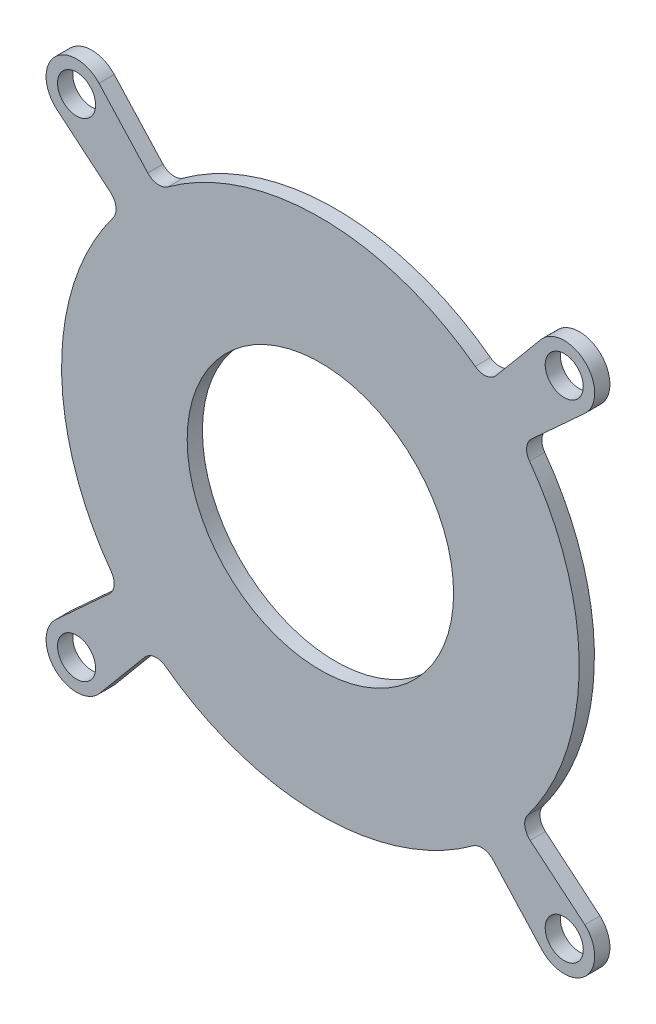
ISO-10303-21;
HEADER;
FILE_DESCRIPTION(('STEP AP214'),'2;1');
FILE_NAME('part.step','',(''),(''),'','','');
FILE_SCHEMA(('AUTOMOTIVE_DESIGN { 1 0 10303 214 1 1 1 1 }'));
ENDSEC;
DATA;
#1=APPLICATION_CONTEXT('core data for automotive mechanical design processes');
#2=APPLICATION_PROTOCOL_DEFINITION('international standard','automotive_design',2000,#1);
#3=PRODUCT_CONTEXT('',#1,'mechanical');
#4=PRODUCT('Part','Part','',(#3));
#5=PRODUCT_RELATED_PRODUCT_CATEGORY('part','',(#4));
#6=PRODUCT_DEFINITION_FORMATION('','',#4);
#7=PRODUCT_DEFINITION_CONTEXT('part definition',#1,'design');
#8=PRODUCT_DEFINITION('design','',#6,#7);
#9=PRODUCT_DEFINITION_SHAPE('','',#8);
#10=(LENGTH_UNIT() NAMED_UNIT(*) SI_UNIT(.MILLI.,.METRE.));
#11=(NAMED_UNIT(*) PLANE_ANGLE_UNIT() SI_UNIT($,.RADIAN.));
#12=(NAMED_UNIT(*) SI_UNIT($,.STERADIAN.) SOLID_ANGLE_UNIT());
#13=UNCERTAINTY_MEASURE_WITH_UNIT(LENGTH_MEASURE(1.E-05),#10,'distance_accuracy_value','');
#14=(GEOMETRIC_REPRESENTATION_CONTEXT(3) GLOBAL_UNCERTAINTY_ASSIGNED_CONTEXT((#13)) GLOBAL_UNIT_ASSIGNED_CONTEXT((#10,
#11,#12)) REPRESENTATION_CONTEXT('',''));
#15=CARTESIAN_POINT('',(0.,0.,0.));
#16=DIRECTION('',(0.,0.,1.));
#17=DIRECTION('',(1.,0.,0.));
#18=AXIS2_PLACEMENT_3D('',#15,#16,#17);
#19=CARTESIAN_POINT('',(32.0354727216565,-31.5983298645137,2.));
#20=DIRECTION('',(0.,0.,1.));
#21=DIRECTION('',(1.,0.,0.));
#22=AXIS2_PLACEMENT_3D('',#19,#20,#21);
#23=PLANE('',#22);
#24=CARTESIAN_POINT('',(32.0354727216543,32.4726155787952,2.));
#25=DIRECTION('',(0.,0.,1.));
#26=DIRECTION('',(1.,0.,0.));
#27=AXIS2_PLACEMENT_3D('',#24,#25,#26);
#28=CIRCLE('',#27,2.5000000000029);
#29=CARTESIAN_POINT('',(34.5354727216572,32.4726155787952,2.));
#30=VERTEX_POINT('',#29);
#31=EDGE_CURVE('E528',#30,#30,#28,.T.);
#32=ORIENTED_EDGE('',*,*,#31,.F.);
#33=EDGE_LOOP('',(#32));
#34=FACE_BOUND('',#33,.T.);
#35=CARTESIAN_POINT('',(-32.0354727216524,-31.5983298645159,2.));
#36=DIRECTION('',(0.,0.,1.));
#37=DIRECTION('',(1.,0.,0.));
#38=AXIS2_PLACEMENT_3D('',#35,#36,#37);
#39=CIRCLE('',#38,2.49999999999642);
#40=CARTESIAN_POINT('',(-29.535472721656,-31.5983298645159,2.));
#41=VERTEX_POINT('',#40);
#42=EDGE_CURVE('E544',#41,#41,#39,.T.);
#43=ORIENTED_EDGE('',*,*,#42,.F.);
#44=EDGE_LOOP('',(#43));
#45=FACE_BOUND('',#44,.T.);
#46=CARTESIAN_POINT('',(32.0354727216565,-31.5983298645137,2.));
#47=DIRECTION('',(0.,0.,1.));
#48=DIRECTION('',(1.,0.,0.));
#49=AXIS2_PLACEMENT_3D('',#46,#47,#48);
#50=CIRCLE('',#49,4.00000000000003);
#51=CARTESIAN_POINT('',(29.0849413750936,-34.2991380348491,2.));
#52=VERTEX_POINT('',#51);
#53=CARTESIAN_POINT('',(34.7362808919919,-28.6477985179509,2.));
#54=VERTEX_POINT('',#53);
#55=EDGE_CURVE('E308',#52,#54,#50,.T.);
#56=ORIENTED_EDGE('',*,*,#55,.T.);
#57=DIRECTION('',(-0.766720690696216,0.641980827173458,0.));
#58=VECTOR('',#57,1.);
#59=CARTESIAN_POINT('',(34.7362808919919,-28.6477985179509,2.));
#60=LINE('',#59,#58);
#61=CARTESIAN_POINT('',(27.5593163533478,-22.6384737572881,2.));
#62=VERTEX_POINT('',#61);
#63=EDGE_CURVE('E148',#54,#62,#60,.T.);
#64=ORIENTED_EDGE('',*,*,#63,.T.);
#65=CARTESIAN_POINT('',(28.8432780076946,-21.1050323758959,2.));
#66=DIRECTION('',(0.,0.,-1.));
#67=DIRECTION('',(-1.,0.,0.));
#68=AXIS2_PLACEMENT_3D('',#65,#66,#67);
#69=CIRCLE('',#68,1.99999999999967);
#70=CARTESIAN_POINT('',(27.2408736739341,-19.9082448629495,2.));
#71=VERTEX_POINT('',#70);
#72=EDGE_CURVE('E393',#62,#71,#69,.T.);
#73=ORIENTED_EDGE('',*,*,#72,.T.);
#74=CARTESIAN_POINT('',(9.99200722162641E-13,0.437142857142837,2.));
#75=DIRECTION('',(0.,0.,1.));
#76=DIRECTION('',(1.,0.,0.));
#77=AXIS2_PLACEMENT_3D('',#74,#75,#76);
#78=CIRCLE('',#77,34.000000000001);
#79=CARTESIAN_POINT('',(27.4749871011398,20.4652502013809,2.));
#80=VERTEX_POINT('',#79);
#81=EDGE_CURVE('E413',#71,#80,#78,.T.);
#82=ORIENTED_EDGE('',*,*,#81,.T.);
#83=CARTESIAN_POINT('',(29.0911628129714,21.6433741628067,2.));
#84=DIRECTION('',(0.,0.,-1.));
#85=DIRECTION('',(1.,0.,0.));
#86=AXIS2_PLACEMENT_3D('',#83,#84,#85);
#87=CIRCLE('',#86,1.99999999999999);
#88=CARTESIAN_POINT('',(27.7407587278038,23.1186398360881,2.));
#89=VERTEX_POINT('',#88);
#90=EDGE_CURVE('E409',#80,#89,#87,.T.);
#91=ORIENTED_EDGE('',*,*,#90,.T.);
#92=DIRECTION('',(0.7376328366407,0.675202042583843,0.));
#93=VECTOR('',#92,1.);
#94=CARTESIAN_POINT('',(34.7362808919891,29.5220842322318,2.));
#95=LINE('',#94,#93);
#96=CARTESIAN_POINT('',(34.7362808919891,29.5220842322318,2.));
#97=VERTEX_POINT('',#96);
#98=EDGE_CURVE('E412',#89,#97,#95,.T.);
#99=ORIENTED_EDGE('',*,*,#98,.T.);
#100=CARTESIAN_POINT('',(32.0354727216462,32.4726155787877,2.));
#101=DIRECTION('',(0.,0.,1.));
#102=DIRECTION('',(1.,0.,0.));
#103=AXIS2_PLACEMENT_3D('',#100,#101,#102);
#104=CIRCLE('',#103,4.00000000000003);
#105=CARTESIAN_POINT('',(29.0849413750908,35.1734237491312,2.));
#106=VERTEX_POINT('',#105);
#107=EDGE_CURVE('E417',#97,#106,#104,.T.);
#108=ORIENTED_EDGE('',*,*,#107,.T.);
#109=DIRECTION('',(-0.641980827173504,-0.766720690696178,0.));
#110=VECTOR('',#109,1.);
#111=CARTESIAN_POINT('',(29.0849413750908,35.1734237491312,2.));
#112=LINE('',#111,#110);
#113=CARTESIAN_POINT('',(23.0756166144313,27.9964592104921,2.));
#114=VERTEX_POINT('',#113);
#115=EDGE_CURVE('E424',#106,#114,#112,.T.);
#116=ORIENTED_EDGE('',*,*,#115,.T.);
#117=CARTESIAN_POINT('',(21.5421752330389,29.280420864839,2.));
#118=DIRECTION('',(0.,0.,-1.));
#119=DIRECTION('',(-1.,0.,0.));
#120=AXIS2_PLACEMENT_3D('',#117,#118,#119);
#121=CIRCLE('',#120,2.);
#122=CARTESIAN_POINT('',(20.3453877200923,27.6780165310783,2.));
#123=VERTEX_POINT('',#122);
#124=EDGE_CURVE('E427',#114,#123,#121,.T.);
#125=ORIENTED_EDGE('',*,*,#124,.T.);
#126=CARTESIAN_POINT('',(3.23767156700697E-13,0.437142857144609,2.));
#127=DIRECTION('',(0.,0.,1.));
#128=DIRECTION('',(1.,0.,0.));
#129=AXIS2_PLACEMENT_3D('',#126,#127,#128);
#130=CIRCLE('',#129,34.0000000000012);
#131=CARTESIAN_POINT('',(-20.0281073442409,27.9121299582814,2.));
#132=VERTEX_POINT('',#131);
#133=EDGE_CURVE('E430',#123,#132,#130,.T.);
#134=ORIENTED_EDGE('',*,*,#133,.T.);
#135=CARTESIAN_POINT('',(-21.2062313056668,29.5283056701129,2.));
#136=DIRECTION('',(0.,0.,-1.));
#137=DIRECTION('',(1.,0.,0.));
#138=AXIS2_PLACEMENT_3D('',#135,#136,#137);
#139=CIRCLE('',#138,1.99999999999998);
#140=CARTESIAN_POINT('',(-22.6814969789482,28.1779015849453,2.));
#141=VERTEX_POINT('',#140);
#142=EDGE_CURVE('E433',#132,#141,#139,.T.);
#143=ORIENTED_EDGE('',*,*,#142,.T.);
#144=DIRECTION('',(-0.675202042583903,0.737632836640645,0.));
#145=VECTOR('',#144,1.);
#146=CARTESIAN_POINT('',(-29.0849413750926,35.1734237491302,2.));
#147=LINE('',#146,#145);
#148=CARTESIAN_POINT('',(-29.0849413750925,35.1734237491302,2.));
#149=VERTEX_POINT('',#148);
#150=EDGE_CURVE('E436',#141,#149,#147,.T.);
#151=ORIENTED_EDGE('',*,*,#150,.T.);
#152=CARTESIAN_POINT('',(-32.0354727216854,32.4726155788242,2.));
#153=DIRECTION('',(0.,0.,1.));
#154=DIRECTION('',(1.,0.,0.));
#155=AXIS2_PLACEMENT_3D('',#152,#153,#154);
#156=CIRCLE('',#155,4.00000000000233);
#157=CARTESIAN_POINT('',(-34.7362808919923,29.5220842322322,2.));
#158=VERTEX_POINT('',#157);
#159=EDGE_CURVE('E439',#149,#158,#156,.T.);
#160=ORIENTED_EDGE('',*,*,#159,.T.);
#161=DIRECTION('',(0.76672069069621,-0.641980827173466,0.));
#162=VECTOR('',#161,1.);
#163=CARTESIAN_POINT('',(-34.7362808919923,29.5220842322322,2.));
#164=LINE('',#163,#162);
#165=CARTESIAN_POINT('',(-27.5593163533485,23.5127594715695,2.));
#166=VERTEX_POINT('',#165);
#167=EDGE_CURVE('E442',#158,#166,#164,.T.);
#168=ORIENTED_EDGE('',*,*,#167,.T.);
#169=CARTESIAN_POINT('',(-28.8432780076955,21.9793180901771,2.));
#170=DIRECTION('',(0.,0.,-1.));
#171=DIRECTION('',(-1.,0.,0.));
#172=AXIS2_PLACEMENT_3D('',#169,#170,#171);
#173=CIRCLE('',#172,2.00000000000002);
#174=CARTESIAN_POINT('',(-27.2408736739342,20.7825305772304,2.));
#175=VERTEX_POINT('',#174);
#176=EDGE_CURVE('E445',#166,#175,#173,.T.);
#177=ORIENTED_EDGE('',*,*,#176,.T.);
#178=CARTESIAN_POINT('',(7.35522753814166E-13,0.437142857142837,2.));
#179=DIRECTION('',(0.,0.,1.));
#180=DIRECTION('',(1.,0.,0.));
#181=AXIS2_PLACEMENT_3D('',#178,#179,#180);
#182=CIRCLE('',#181,33.9999999999996);
#183=CARTESIAN_POINT('',(-27.474987101134,-19.5909644870978,2.));
#184=VERTEX_POINT('',#183);
#185=EDGE_CURVE('E448',#175,#184,#182,.T.);
#186=ORIENTED_EDGE('',*,*,#185,.T.);
#187=CARTESIAN_POINT('',(-29.0911628129655,-20.7690884485238,2.));
#188=DIRECTION('',(0.,0.,-1.));
#189=DIRECTION('',(1.,0.,0.));
#190=AXIS2_PLACEMENT_3D('',#187,#188,#189);
#191=CIRCLE('',#190,2.);
#192=CARTESIAN_POINT('',(-27.7407587277978,-22.2443541218052,2.));
#193=VERTEX_POINT('',#192);
#194=EDGE_CURVE('E451',#184,#193,#191,.T.);
#195=ORIENTED_EDGE('',*,*,#194,.T.);
#196=DIRECTION('',(-0.737632836640711,-0.675202042583831,0.));
#197=VECTOR('',#196,1.);
#198=CARTESIAN_POINT('',(-34.7362808919889,-28.647798517954,2.));
#199=LINE('',#198,#197);
#200=CARTESIAN_POINT('',(-34.7362808919889,-28.6477985179541,2.));
#201=VERTEX_POINT('',#200);
#202=EDGE_CURVE('E454',#193,#201,#199,.T.);
#203=ORIENTED_EDGE('',*,*,#202,.T.);
#204=CARTESIAN_POINT('',(-32.0354727216524,-31.5983298645159,2.));
#205=DIRECTION('',(0.,0.,1.));
#206=DIRECTION('',(1.,0.,0.));
#207=AXIS2_PLACEMENT_3D('',#204,#205,#206);
#208=CIRCLE('',#207,4.00000000000007);
#209=CARTESIAN_POINT('',(-29.0849413750896,-34.2991380348513,2.));
#210=VERTEX_POINT('',#209);
#211=EDGE_CURVE('E457',#201,#210,#208,.T.);
#212=ORIENTED_EDGE('',*,*,#211,.T.);
#213=DIRECTION('',(0.641980827173464,0.766720690696211,0.));
#214=VECTOR('',#213,1.);
#215=CARTESIAN_POINT('',(-29.0849413750896,-34.2991380348513,2.));
#216=LINE('',#215,#214);
#217=CARTESIAN_POINT('',(-23.0756166144263,-27.1221734962068,2.));
#218=VERTEX_POINT('',#217);
#219=EDGE_CURVE('E460',#210,#218,#216,.T.);
#220=ORIENTED_EDGE('',*,*,#219,.T.);
#221=CARTESIAN_POINT('',(-21.5421752330338,-28.4061351505537,2.));
#222=DIRECTION('',(0.,0.,-1.));
#223=DIRECTION('',(-1.,0.,0.));
#224=AXIS2_PLACEMENT_3D('',#221,#222,#223);
#225=CIRCLE('',#224,2.00000000000001);
#226=CARTESIAN_POINT('',(-20.3453877200875,-26.8037308167928,2.));
#227=VERTEX_POINT('',#226);
#228=EDGE_CURVE('E215',#218,#227,#225,.T.);
#229=ORIENTED_EDGE('',*,*,#228,.T.);
#230=CARTESIAN_POINT('',(0.,0.437142857143018,2.));
#231=DIRECTION('',(0.,0.,1.));
#232=DIRECTION('',(1.,0.,0.));
#233=AXIS2_PLACEMENT_3D('',#230,#231,#232);
#234=CIRCLE('',#233,34.0000000000002);
#235=CARTESIAN_POINT('',(20.0281073442381,-27.0378442439947,2.));
#236=VERTEX_POINT('',#235);
#237=EDGE_CURVE('E209',#227,#236,#234,.T.);
#238=ORIENTED_EDGE('',*,*,#237,.T.);
#239=CARTESIAN_POINT('',(21.2062313056639,-28.6540199558263,2.));
#240=DIRECTION('',(0.,0.,-1.));
#241=DIRECTION('',(1.,0.,0.));
#242=AXIS2_PLACEMENT_3D('',#239,#240,#241);
#243=CIRCLE('',#242,2.);
#244=CARTESIAN_POINT('',(22.6814969789453,-27.3036158706586,2.));
#245=VERTEX_POINT('',#244);
#246=EDGE_CURVE('E213',#236,#245,#243,.T.);
#247=ORIENTED_EDGE('',*,*,#246,.T.);
#248=DIRECTION('',(0.675202042583839,-0.737632836640704,0.));
#249=VECTOR('',#248,1.);
#250=CARTESIAN_POINT('',(29.0849413750936,-34.2991380348491,2.));
#251=LINE('',#250,#249);
#252=EDGE_CURVE('E57',#245,#52,#251,.T.);
#253=ORIENTED_EDGE('',*,*,#252,.T.);
#254=EDGE_LOOP('',(#56,#64,#73,#82,#91,#99,#108,#116,#125,#134,#143,#151,#160,#168,#177,#186,
#195,#203,#212,#220,#229,#238,#247,#253));
#255=FACE_BOUND('',#254,.T.);
#256=CARTESIAN_POINT('',(32.0354727216565,-31.5983298645137,2.));
#257=DIRECTION('',(0.,0.,1.));
#258=DIRECTION('',(1.,0.,0.));
#259=AXIS2_PLACEMENT_3D('',#256,#257,#258);
#260=CIRCLE('',#259,2.5);
#261=CARTESIAN_POINT('',(34.5354727216565,-31.5983298645137,2.));
#262=VERTEX_POINT('',#261);
#263=EDGE_CURVE('E242',#262,#262,#260,.T.);
#264=ORIENTED_EDGE('',*,*,#263,.F.);
#265=EDGE_LOOP('',(#264));
#266=FACE_BOUND('',#265,.T.);
#267=CARTESIAN_POINT('',(-32.0354727216546,32.4726155787929,2.));
#268=DIRECTION('',(0.,0.,1.));
#269=DIRECTION('',(1.,0.,0.));
#270=AXIS2_PLACEMENT_3D('',#267,#268,#269);
#271=CIRCLE('',#270,2.4999999999996);
#272=CARTESIAN_POINT('',(-29.535472721655,32.4726155787929,2.));
#273=VERTEX_POINT('',#272);
#274=EDGE_CURVE('E536',#273,#273,#271,.T.);
#275=ORIENTED_EDGE('',*,*,#274,.F.);
#276=EDGE_LOOP('',(#275));
#277=FACE_BOUND('',#276,.T.);
#278=CARTESIAN_POINT('',(3.23767156700697E-13,0.437142857144609,2.));
#279=DIRECTION('',(0.,0.,1.));
#280=DIRECTION('',(1.,0.,0.));
#281=AXIS2_PLACEMENT_3D('',#278,#279,#280);
#282=CIRCLE('',#281,17.5);
#283=CARTESIAN_POINT('',(17.5000000000003,0.437142857144609,2.));
#284=VERTEX_POINT('',#283);
#285=EDGE_CURVE('E517',#284,#284,#282,.T.);
#286=ORIENTED_EDGE('',*,*,#285,.F.);
#287=EDGE_LOOP('',(#286));
#288=FACE_BOUND('',#287,.T.);
#289=ADVANCED_FACE('F39',(#34,#45,#255,#266,#277,#288),#23,.T.);
#290=CARTESIAN_POINT('',(32.0354727216565,-31.5983298645137,0.));
#291=DIRECTION('',(0.,0.,1.));
#292=DIRECTION('',(1.,0.,0.));
#293=AXIS2_PLACEMENT_3D('',#290,#291,#292);
#294=PLANE('',#293);
#295=CARTESIAN_POINT('',(32.0354727216565,-31.5983298645137,0.));
#296=DIRECTION('',(0.,0.,1.));
#297=DIRECTION('',(1.,0.,0.));
#298=AXIS2_PLACEMENT_3D('',#295,#296,#297);
#299=CIRCLE('',#298,4.00000000000003);
#300=CARTESIAN_POINT('',(29.0849413750936,-34.2991380348491,0.));
#301=VERTEX_POINT('',#300);
#302=CARTESIAN_POINT('',(34.7362808919919,-28.6477985179509,0.));
#303=VERTEX_POINT('',#302);
#304=EDGE_CURVE('E237',#301,#303,#299,.T.);
#305=ORIENTED_EDGE('',*,*,#304,.F.);
#306=DIRECTION('',(0.675202042583839,-0.737632836640704,0.));
#307=VECTOR('',#306,1.);
#308=CARTESIAN_POINT('',(29.0849413750936,-34.2991380348491,0.));
#309=LINE('',#308,#307);
#310=CARTESIAN_POINT('',(22.6814969789453,-27.3036158706586,0.));
#311=VERTEX_POINT('',#310);
#312=EDGE_CURVE('E140',#311,#301,#309,.T.);
#313=ORIENTED_EDGE('',*,*,#312,.F.);
#314=CARTESIAN_POINT('',(21.2062313056639,-28.6540199558263,0.));
#315=DIRECTION('',(0.,0.,-1.));
#316=DIRECTION('',(1.,0.,0.));
#317=AXIS2_PLACEMENT_3D('',#314,#315,#316);
#318=CIRCLE('',#317,2.);
#319=CARTESIAN_POINT('',(20.0281073442381,-27.0378442439947,0.));
#320=VERTEX_POINT('',#319);
#321=EDGE_CURVE('E134',#320,#311,#318,.T.);
#322=ORIENTED_EDGE('',*,*,#321,.F.);
#323=CARTESIAN_POINT('',(0.,0.437142857143018,0.));
#324=DIRECTION('',(0.,0.,1.));
#325=DIRECTION('',(1.,0.,0.));
#326=AXIS2_PLACEMENT_3D('',#323,#324,#325);
#327=CIRCLE('',#326,34.0000000000002);
#328=CARTESIAN_POINT('',(-20.3453877200875,-26.8037308167928,0.));
#329=VERTEX_POINT('',#328);
#330=EDGE_CURVE('E224',#329,#320,#327,.T.);
#331=ORIENTED_EDGE('',*,*,#330,.F.);
#332=CARTESIAN_POINT('',(-21.5421752330338,-28.4061351505537,0.));
#333=DIRECTION('',(0.,0.,-1.));
#334=DIRECTION('',(-1.,0.,0.));
#335=AXIS2_PLACEMENT_3D('',#332,#333,#334);
#336=CIRCLE('',#335,2.00000000000001);
#337=CARTESIAN_POINT('',(-23.0756166144263,-27.1221734962068,0.));
#338=VERTEX_POINT('',#337);
#339=EDGE_CURVE('E299',#338,#329,#336,.T.);
#340=ORIENTED_EDGE('',*,*,#339,.F.);
#341=DIRECTION('',(0.641980827173464,0.766720690696211,0.));
#342=VECTOR('',#341,1.);
#343=CARTESIAN_POINT('',(-29.0849413750896,-34.2991380348513,0.));
#344=LINE('',#343,#342);
#345=CARTESIAN_POINT('',(-29.0849413750896,-34.2991380348513,0.));
#346=VERTEX_POINT('',#345);
#347=EDGE_CURVE('E296',#346,#338,#344,.T.);
#348=ORIENTED_EDGE('',*,*,#347,.F.);
#349=CARTESIAN_POINT('',(-32.0354727216524,-31.5983298645159,0.));
#350=DIRECTION('',(0.,0.,1.));
#351=DIRECTION('',(1.,0.,0.));
#352=AXIS2_PLACEMENT_3D('',#349,#350,#351);
#353=CIRCLE('',#352,4.00000000000007);
#354=CARTESIAN_POINT('',(-34.7362808919889,-28.6477985179541,0.));
#355=VERTEX_POINT('',#354);
#356=EDGE_CURVE('E293',#355,#346,#353,.T.);
#357=ORIENTED_EDGE('',*,*,#356,.F.);
#358=DIRECTION('',(-0.737632836640711,-0.675202042583831,0.));
#359=VECTOR('',#358,1.);
#360=CARTESIAN_POINT('',(-34.7362808919889,-28.647798517954,0.));
#361=LINE('',#360,#359);
#362=CARTESIAN_POINT('',(-27.7407587277978,-22.2443541218052,0.));
#363=VERTEX_POINT('',#362);
#364=EDGE_CURVE('E290',#363,#355,#361,.T.);
#365=ORIENTED_EDGE('',*,*,#364,.F.);
#366=CARTESIAN_POINT('',(-29.0911628129655,-20.7690884485238,0.));
#367=DIRECTION('',(0.,0.,-1.));
#368=DIRECTION('',(1.,0.,0.));
#369=AXIS2_PLACEMENT_3D('',#366,#367,#368);
#370=CIRCLE('',#369,2.);
#371=CARTESIAN_POINT('',(-27.474987101134,-19.5909644870978,0.));
#372=VERTEX_POINT('',#371);
#373=EDGE_CURVE('E287',#372,#363,#370,.T.);
#374=ORIENTED_EDGE('',*,*,#373,.F.);
#375=CARTESIAN_POINT('',(7.35522753814166E-13,0.437142857142837,0.));
#376=DIRECTION('',(0.,0.,1.));
#377=DIRECTION('',(1.,0.,0.));
#378=AXIS2_PLACEMENT_3D('',#375,#376,#377);
#379=CIRCLE('',#378,33.9999999999996);
#380=CARTESIAN_POINT('',(-27.2408736739342,20.7825305772304,0.));
#381=VERTEX_POINT('',#380);
#382=EDGE_CURVE('E284',#381,#372,#379,.T.);
#383=ORIENTED_EDGE('',*,*,#382,.F.);
#384=CARTESIAN_POINT('',(-28.8432780076955,21.9793180901771,0.));
#385=DIRECTION('',(0.,0.,-1.));
#386=DIRECTION('',(-1.,0.,0.));
#387=AXIS2_PLACEMENT_3D('',#384,#385,#386);
#388=CIRCLE('',#387,2.00000000000002);
#389=CARTESIAN_POINT('',(-27.5593163533485,23.5127594715695,0.));
#390=VERTEX_POINT('',#389);
#391=EDGE_CURVE('E281',#390,#381,#388,.T.);
#392=ORIENTED_EDGE('',*,*,#391,.F.);
#393=DIRECTION('',(0.76672069069621,-0.641980827173466,0.));
#394=VECTOR('',#393,1.);
#395=CARTESIAN_POINT('',(-34.7362808919923,29.5220842322322,0.));
#396=LINE('',#395,#394);
#397=CARTESIAN_POINT('',(-34.7362808919923,29.5220842322322,0.));
#398=VERTEX_POINT('',#397);
#399=EDGE_CURVE('E278',#398,#390,#396,.T.);
#400=ORIENTED_EDGE('',*,*,#399,.F.);
#401=CARTESIAN_POINT('',(-32.0354727216854,32.4726155788242,0.));
#402=DIRECTION('',(0.,0.,1.));
#403=DIRECTION('',(1.,0.,0.));
#404=AXIS2_PLACEMENT_3D('',#401,#402,#403);
#405=CIRCLE('',#404,4.00000000000233);
#406=CARTESIAN_POINT('',(-29.0849413750925,35.1734237491302,0.));
#407=VERTEX_POINT('',#406);
#408=EDGE_CURVE('E275',#407,#398,#405,.T.);
#409=ORIENTED_EDGE('',*,*,#408,.F.);
#410=DIRECTION('',(-0.675202042583903,0.737632836640645,0.));
#411=VECTOR('',#410,1.);
#412=CARTESIAN_POINT('',(-29.0849413750926,35.1734237491302,0.));
#413=LINE('',#412,#411);
#414=CARTESIAN_POINT('',(-22.6814969789482,28.1779015849453,0.));
#415=VERTEX_POINT('',#414);
#416=EDGE_CURVE('E272',#415,#407,#413,.T.);
#417=ORIENTED_EDGE('',*,*,#416,.F.);
#418=CARTESIAN_POINT('',(-21.2062313056668,29.5283056701129,0.));
#419=DIRECTION('',(0.,0.,-1.));
#420=DIRECTION('',(1.,0.,0.));
#421=AXIS2_PLACEMENT_3D('',#418,#419,#420);
#422=CIRCLE('',#421,1.99999999999998);
#423=CARTESIAN_POINT('',(-20.0281073442409,27.9121299582814,0.));
#424=VERTEX_POINT('',#423);
#425=EDGE_CURVE('E269',#424,#415,#422,.T.);
#426=ORIENTED_EDGE('',*,*,#425,.F.);
#427=CARTESIAN_POINT('',(3.23767156700697E-13,0.437142857144609,0.));
#428=DIRECTION('',(0.,0.,1.));
#429=DIRECTION('',(1.,0.,0.));
#430=AXIS2_PLACEMENT_3D('',#427,#428,#429);
#431=CIRCLE('',#430,34.0000000000012);
#432=CARTESIAN_POINT('',(20.3453877200923,27.6780165310783,0.));
#433=VERTEX_POINT('',#432);
#434=EDGE_CURVE('E266',#433,#424,#431,.T.);
#435=ORIENTED_EDGE('',*,*,#434,.F.);
#436=CARTESIAN_POINT('',(21.5421752330389,29.280420864839,0.));
#437=DIRECTION('',(0.,0.,-1.));
#438=DIRECTION('',(-1.,0.,0.));
#439=AXIS2_PLACEMENT_3D('',#436,#437,#438);
#440=CIRCLE('',#439,2.);
#441=CARTESIAN_POINT('',(23.0756166144313,27.9964592104921,0.));
#442=VERTEX_POINT('',#441);
#443=EDGE_CURVE('E263',#442,#433,#440,.T.);
#444=ORIENTED_EDGE('',*,*,#443,.F.);
#445=DIRECTION('',(-0.641980827173504,-0.766720690696178,0.));
#446=VECTOR('',#445,1.);
#447=CARTESIAN_POINT('',(29.0849413750908,35.1734237491312,0.));
#448=LINE('',#447,#446);
#449=CARTESIAN_POINT('',(29.0849413750908,35.1734237491312,0.));
#450=VERTEX_POINT('',#449);
#451=EDGE_CURVE('E260',#450,#442,#448,.T.);
#452=ORIENTED_EDGE('',*,*,#451,.F.);
#453=CARTESIAN_POINT('',(32.0354727216462,32.4726155787877,0.));
#454=DIRECTION('',(0.,0.,1.));
#455=DIRECTION('',(1.,0.,0.));
#456=AXIS2_PLACEMENT_3D('',#453,#454,#455);
#457=CIRCLE('',#456,4.00000000000003);
#458=CARTESIAN_POINT('',(34.7362808919891,29.5220842322318,0.));
#459=VERTEX_POINT('',#458);
#460=EDGE_CURVE('E257',#459,#450,#457,.T.);
#461=ORIENTED_EDGE('',*,*,#460,.F.);
#462=DIRECTION('',(0.7376328366407,0.675202042583843,0.));
#463=VECTOR('',#462,1.);
#464=CARTESIAN_POINT('',(34.7362808919891,29.5220842322318,0.));
#465=LINE('',#464,#463);
#466=CARTESIAN_POINT('',(27.7407587278038,23.1186398360881,0.));
#467=VERTEX_POINT('',#466);
#468=EDGE_CURVE('E254',#467,#459,#465,.T.);
#469=ORIENTED_EDGE('',*,*,#468,.F.);
#470=CARTESIAN_POINT('',(29.0911628129714,21.6433741628067,0.));
#471=DIRECTION('',(0.,0.,-1.));
#472=DIRECTION('',(1.,0.,0.));
#473=AXIS2_PLACEMENT_3D('',#470,#471,#472);
#474=CIRCLE('',#473,1.99999999999999);
#475=CARTESIAN_POINT('',(27.4749871011398,20.4652502013809,0.));
#476=VERTEX_POINT('',#475);
#477=EDGE_CURVE('E251',#476,#467,#474,.T.);
#478=ORIENTED_EDGE('',*,*,#477,.F.);
#479=CARTESIAN_POINT('',(9.99200722162641E-13,0.437142857142837,0.));
#480=DIRECTION('',(0.,0.,1.));
#481=DIRECTION('',(1.,0.,0.));
#482=AXIS2_PLACEMENT_3D('',#479,#480,#481);
#483=CIRCLE('',#482,34.000000000001);
#484=CARTESIAN_POINT('',(27.2408736739341,-19.9082448629495,0.));
#485=VERTEX_POINT('',#484);
#486=EDGE_CURVE('E248',#485,#476,#483,.T.);
#487=ORIENTED_EDGE('',*,*,#486,.F.);
#488=CARTESIAN_POINT('',(28.8432780076946,-21.1050323758959,0.));
#489=DIRECTION('',(0.,0.,-1.));
#490=DIRECTION('',(-1.,0.,0.));
#491=AXIS2_PLACEMENT_3D('',#488,#489,#490);
#492=CIRCLE('',#491,1.99999999999967);
#493=CARTESIAN_POINT('',(27.5593163533478,-22.6384737572881,0.));
#494=VERTEX_POINT('',#493);
#495=EDGE_CURVE('E245',#494,#485,#492,.T.);
#496=ORIENTED_EDGE('',*,*,#495,.F.);
#497=DIRECTION('',(-0.766720690696216,0.641980827173458,0.));
#498=VECTOR('',#497,1.);
#499=CARTESIAN_POINT('',(34.7362808919919,-28.6477985179509,0.));
#500=LINE('',#499,#498);
#501=EDGE_CURVE('E241',#303,#494,#500,.T.);
#502=ORIENTED_EDGE('',*,*,#501,.F.);
#503=EDGE_LOOP('',(#305,#313,#322,#331,#340,#348,#357,#365,#374,#383,#392,#400,#409,#417,#426,
#435,#444,#452,#461,#469,#478,#487,#496,#502));
#504=FACE_BOUND('',#503,.T.);
#505=CARTESIAN_POINT('',(32.0354727216565,-31.5983298645137,0.));
#506=DIRECTION('',(0.,0.,1.));
#507=DIRECTION('',(1.,0.,0.));
#508=AXIS2_PLACEMENT_3D('',#505,#506,#507);
#509=CIRCLE('',#508,2.5);
#510=CARTESIAN_POINT('',(34.5354727216565,-31.5983298645137,0.));
#511=VERTEX_POINT('',#510);
#512=EDGE_CURVE('E548',#511,#511,#509,.T.);
#513=ORIENTED_EDGE('',*,*,#512,.T.);
#514=EDGE_LOOP('',(#513));
#515=FACE_BOUND('',#514,.T.);
#516=CARTESIAN_POINT('',(-32.0354727216524,-31.5983298645159,0.));
#517=DIRECTION('',(0.,0.,1.));
#518=DIRECTION('',(1.,0.,0.));
#519=AXIS2_PLACEMENT_3D('',#516,#517,#518);
#520=CIRCLE('',#519,2.49999999999642);
#521=CARTESIAN_POINT('',(-29.535472721656,-31.5983298645159,0.));
#522=VERTEX_POINT('',#521);
#523=EDGE_CURVE('E540',#522,#522,#520,.T.);
#524=ORIENTED_EDGE('',*,*,#523,.T.);
#525=EDGE_LOOP('',(#524));
#526=FACE_BOUND('',#525,.T.);
#527=CARTESIAN_POINT('',(-32.0354727216546,32.4726155787929,0.));
#528=DIRECTION('',(0.,0.,1.));
#529=DIRECTION('',(1.,0.,0.));
#530=AXIS2_PLACEMENT_3D('',#527,#528,#529);
#531=CIRCLE('',#530,2.4999999999996);
#532=CARTESIAN_POINT('',(-29.535472721655,32.4726155787929,0.));
#533=VERTEX_POINT('',#532);
#534=EDGE_CURVE('E532',#533,#533,#531,.T.);
#535=ORIENTED_EDGE('',*,*,#534,.T.);
#536=EDGE_LOOP('',(#535));
#537=FACE_BOUND('',#536,.T.);
#538=CARTESIAN_POINT('',(32.0354727216543,32.4726155787952,0.));
#539=DIRECTION('',(0.,0.,1.));
#540=DIRECTION('',(1.,0.,0.));
#541=AXIS2_PLACEMENT_3D('',#538,#539,#540);
#542=CIRCLE('',#541,2.5000000000029);
#543=CARTESIAN_POINT('',(34.5354727216572,32.4726155787952,0.));
#544=VERTEX_POINT('',#543);
#545=EDGE_CURVE('E525',#544,#544,#542,.T.);
#546=ORIENTED_EDGE('',*,*,#545,.T.);
#547=EDGE_LOOP('',(#546));
#548=FACE_BOUND('',#547,.T.);
#549=CARTESIAN_POINT('',(3.23767156700697E-13,0.437142857144609,0.));
#550=DIRECTION('',(0.,0.,1.));
#551=DIRECTION('',(1.,0.,0.));
#552=AXIS2_PLACEMENT_3D('',#549,#550,#551);
#553=CIRCLE('',#552,17.5);
#554=CARTESIAN_POINT('',(17.5000000000003,0.437142857144609,0.));
#555=VERTEX_POINT('',#554);
#556=EDGE_CURVE('E520',#555,#555,#553,.T.);
#557=ORIENTED_EDGE('',*,*,#556,.T.);
#558=EDGE_LOOP('',(#557));
#559=FACE_BOUND('',#558,.T.);
#560=ADVANCED_FACE('F397',(#504,#515,#526,#537,#548,#559),#294,.F.);
#561=CARTESIAN_POINT('',(32.0354727216565,-31.5983298645137,2.));
#562=DIRECTION('',(0.,0.,-1.));
#563=DIRECTION('',(-1.,0.,0.));
#564=AXIS2_PLACEMENT_3D('',#561,#562,#563);
#565=CYLINDRICAL_SURFACE('',#564,4.00000000000003);
#566=ORIENTED_EDGE('',*,*,#304,.T.);
#567=DIRECTION('',(0.,0.,-1.));
#568=VECTOR('',#567,1.);
#569=CARTESIAN_POINT('',(34.7362808919919,-28.6477985179509,2.));
#570=LINE('',#569,#568);
#571=EDGE_CURVE('E11',#54,#303,#570,.T.);
#572=ORIENTED_EDGE('',*,*,#571,.F.);
#573=ORIENTED_EDGE('',*,*,#55,.F.);
#574=DIRECTION('',(0.,0.,-1.));
#575=VECTOR('',#574,1.);
#576=CARTESIAN_POINT('',(29.0849413750936,-34.2991380348491,2.));
#577=LINE('',#576,#575);
#578=EDGE_CURVE('E233',#52,#301,#577,.T.);
#579=ORIENTED_EDGE('',*,*,#578,.T.);
#580=EDGE_LOOP('',(#566,#572,#573,#579));
#581=FACE_BOUND('',#580,.T.);
#582=ADVANCED_FACE('F41',(#581),#565,.T.);
#583=CARTESIAN_POINT('',(34.7362808919919,-28.6477985179509,2.));
#584=DIRECTION('',(-0.641980827173458,-0.766720690696216,0.));
#585=DIRECTION('',(0.766720690696216,-0.641980827173458,0.));
#586=AXIS2_PLACEMENT_3D('',#583,#584,#585);
#587=PLANE('',#586);
#588=ORIENTED_EDGE('',*,*,#501,.T.);
#589=DIRECTION('',(0.,0.,-1.));
#590=VECTOR('',#589,1.);
#591=CARTESIAN_POINT('',(27.5593163533478,-22.6384737572881,2.));
#592=LINE('',#591,#590);
#593=EDGE_CURVE('E49',#62,#494,#592,.T.);
#594=ORIENTED_EDGE('',*,*,#593,.F.);
#595=ORIENTED_EDGE('',*,*,#63,.F.);
#596=ORIENTED_EDGE('',*,*,#571,.T.);
#597=EDGE_LOOP('',(#588,#594,#595,#596));
#598=FACE_BOUND('',#597,.T.);
#599=ADVANCED_FACE('F793',(#598),#587,.F.);
#600=CARTESIAN_POINT('',(28.8432780076946,-21.1050323758959,2.));
#601=DIRECTION('',(0.,0.,-1.));
#602=DIRECTION('',(-1.,0.,0.));
#603=AXIS2_PLACEMENT_3D('',#600,#601,#602);
#604=CYLINDRICAL_SURFACE('',#603,1.99999999999967);
#605=ORIENTED_EDGE('',*,*,#495,.T.);
#606=DIRECTION('',(0.,0.,-1.));
#607=VECTOR('',#606,1.);
#608=CARTESIAN_POINT('',(27.2408736739341,-19.9082448629495,2.));
#609=LINE('',#608,#607);
#610=EDGE_CURVE('E383',#71,#485,#609,.T.);
#611=ORIENTED_EDGE('',*,*,#610,.F.);
#612=ORIENTED_EDGE('',*,*,#72,.F.);
#613=ORIENTED_EDGE('',*,*,#593,.T.);
#614=EDGE_LOOP('',(#605,#611,#612,#613));
#615=FACE_BOUND('',#614,.T.);
#616=ADVANCED_FACE('F391',(#615),#604,.F.);
#617=CARTESIAN_POINT('',(9.99200722162641E-13,0.437142857142837,2.));
#618=DIRECTION('',(0.,0.,-1.));
#619=DIRECTION('',(-1.,0.,0.));
#620=AXIS2_PLACEMENT_3D('',#617,#618,#619);
#621=CYLINDRICAL_SURFACE('',#620,34.000000000001);
#622=ORIENTED_EDGE('',*,*,#486,.T.);
#623=DIRECTION('',(0.,0.,-1.));
#624=VECTOR('',#623,1.);
#625=CARTESIAN_POINT('',(27.4749871011398,20.4652502013809,2.));
#626=LINE('',#625,#624);
#627=EDGE_CURVE('E379',#80,#476,#626,.T.);
#628=ORIENTED_EDGE('',*,*,#627,.F.);
#629=ORIENTED_EDGE('',*,*,#81,.F.);
#630=ORIENTED_EDGE('',*,*,#610,.T.);
#631=EDGE_LOOP('',(#622,#628,#629,#630));
#632=FACE_BOUND('',#631,.T.);
#633=ADVANCED_FACE('F403',(#632),#621,.T.);
#634=CARTESIAN_POINT('',(29.0911628129714,21.6433741628067,2.));
#635=DIRECTION('',(0.,0.,-1.));
#636=DIRECTION('',(-1.,0.,0.));
#637=AXIS2_PLACEMENT_3D('',#634,#635,#636);
#638=CYLINDRICAL_SURFACE('',#637,1.99999999999999);
#639=ORIENTED_EDGE('',*,*,#477,.T.);
#640=DIRECTION('',(0.,0.,-1.));
#641=VECTOR('',#640,1.);
#642=CARTESIAN_POINT('',(27.7407587278038,23.1186398360881,2.));
#643=LINE('',#642,#641);
#644=EDGE_CURVE('E375',#89,#467,#643,.T.);
#645=ORIENTED_EDGE('',*,*,#644,.F.);
#646=ORIENTED_EDGE('',*,*,#90,.F.);
#647=ORIENTED_EDGE('',*,*,#627,.T.);
#648=EDGE_LOOP('',(#639,#645,#646,#647));
#649=FACE_BOUND('',#648,.T.);
#650=ADVANCED_FACE('F407',(#649),#638,.F.);
#651=CARTESIAN_POINT('',(34.7362808919891,29.5220842322318,2.));
#652=DIRECTION('',(-0.675202042583843,0.7376328366407,0.));
#653=DIRECTION('',(-0.7376328366407,-0.675202042583843,0.));
#654=AXIS2_PLACEMENT_3D('',#651,#652,#653);
#655=PLANE('',#654);
#656=ORIENTED_EDGE('',*,*,#468,.T.);
#657=DIRECTION('',(0.,0.,-1.));
#658=VECTOR('',#657,1.);
#659=CARTESIAN_POINT('',(34.7362808919891,29.5220842322318,2.));
#660=LINE('',#659,#658);
#661=EDGE_CURVE('E371',#97,#459,#660,.T.);
#662=ORIENTED_EDGE('',*,*,#661,.F.);
#663=ORIENTED_EDGE('',*,*,#98,.F.);
#664=ORIENTED_EDGE('',*,*,#644,.T.);
#665=EDGE_LOOP('',(#656,#662,#663,#664));
#666=FACE_BOUND('',#665,.T.);
#667=ADVANCED_FACE('F758',(#666),#655,.F.);
#668=CARTESIAN_POINT('',(32.0354727216462,32.4726155787877,2.));
#669=DIRECTION('',(0.,0.,-1.));
#670=DIRECTION('',(-1.,0.,0.));
#671=AXIS2_PLACEMENT_3D('',#668,#669,#670);
#672=CYLINDRICAL_SURFACE('',#671,4.00000000000003);
#673=ORIENTED_EDGE('',*,*,#460,.T.);
#674=DIRECTION('',(0.,0.,-1.));
#675=VECTOR('',#674,1.);
#676=CARTESIAN_POINT('',(29.0849413750908,35.1734237491312,2.));
#677=LINE('',#676,#675);
#678=EDGE_CURVE('E367',#106,#450,#677,.T.);
#679=ORIENTED_EDGE('',*,*,#678,.F.);
#680=ORIENTED_EDGE('',*,*,#107,.F.);
#681=ORIENTED_EDGE('',*,*,#661,.T.);
#682=EDGE_LOOP('',(#673,#679,#680,#681));
#683=FACE_BOUND('',#682,.T.);
#684=ADVANCED_FACE('F748',(#683),#672,.T.);
#685=CARTESIAN_POINT('',(29.0849413750908,35.1734237491312,2.));
#686=DIRECTION('',(0.766720690696178,-0.641980827173504,0.));
#687=DIRECTION('',(0.641980827173504,0.766720690696178,0.));
#688=AXIS2_PLACEMENT_3D('',#685,#686,#687);
#689=PLANE('',#688);
#690=ORIENTED_EDGE('',*,*,#451,.T.);
#691=DIRECTION('',(0.,0.,-1.));
#692=VECTOR('',#691,1.);
#693=CARTESIAN_POINT('',(23.0756166144313,27.9964592104921,2.));
#694=LINE('',#693,#692);
#695=EDGE_CURVE('E363',#114,#442,#694,.T.);
#696=ORIENTED_EDGE('',*,*,#695,.F.);
#697=ORIENTED_EDGE('',*,*,#115,.F.);
#698=ORIENTED_EDGE('',*,*,#678,.T.);
#699=EDGE_LOOP('',(#690,#696,#697,#698));
#700=FACE_BOUND('',#699,.T.);
#701=ADVANCED_FACE('F738',(#700),#689,.F.);
#702=CARTESIAN_POINT('',(21.5421752330389,29.280420864839,2.));
#703=DIRECTION('',(0.,0.,-1.));
#704=DIRECTION('',(-1.,0.,0.));
#705=AXIS2_PLACEMENT_3D('',#702,#703,#704);
#706=CYLINDRICAL_SURFACE('',#705,2.);
#707=ORIENTED_EDGE('',*,*,#443,.T.);
#708=DIRECTION('',(0.,0.,-1.));
#709=VECTOR('',#708,1.);
#710=CARTESIAN_POINT('',(20.3453877200923,27.6780165310783,2.));
#711=LINE('',#710,#709);
#712=EDGE_CURVE('E359',#123,#433,#711,.T.);
#713=ORIENTED_EDGE('',*,*,#712,.F.);
#714=ORIENTED_EDGE('',*,*,#124,.F.);
#715=ORIENTED_EDGE('',*,*,#695,.T.);
#716=EDGE_LOOP('',(#707,#713,#714,#715));
#717=FACE_BOUND('',#716,.T.);
#718=ADVANCED_FACE('F728',(#717),#706,.F.);
#719=CARTESIAN_POINT('',(3.23767156700697E-13,0.437142857144609,2.));
#720=DIRECTION('',(0.,0.,-1.));
#721=DIRECTION('',(-1.,0.,0.));
#722=AXIS2_PLACEMENT_3D('',#719,#720,#721);
#723=CYLINDRICAL_SURFACE('',#722,34.0000000000012);
#724=ORIENTED_EDGE('',*,*,#434,.T.);
#725=DIRECTION('',(0.,0.,-1.));
#726=VECTOR('',#725,1.);
#727=CARTESIAN_POINT('',(-20.0281073442409,27.9121299582814,2.));
#728=LINE('',#727,#726);
#729=EDGE_CURVE('E355',#132,#424,#728,.T.);
#730=ORIENTED_EDGE('',*,*,#729,.F.);
#731=ORIENTED_EDGE('',*,*,#133,.F.);
#732=ORIENTED_EDGE('',*,*,#712,.T.);
#733=EDGE_LOOP('',(#724,#730,#731,#732));
#734=FACE_BOUND('',#733,.T.);
#735=ADVANCED_FACE('F718',(#734),#723,.T.);
#736=CARTESIAN_POINT('',(-21.2062313056668,29.5283056701129,2.));
#737=DIRECTION('',(0.,0.,-1.));
#738=DIRECTION('',(-1.,0.,0.));
#739=AXIS2_PLACEMENT_3D('',#736,#737,#738);
#740=CYLINDRICAL_SURFACE('',#739,1.99999999999998);
#741=ORIENTED_EDGE('',*,*,#425,.T.);
#742=DIRECTION('',(0.,0.,-1.));
#743=VECTOR('',#742,1.);
#744=CARTESIAN_POINT('',(-22.6814969789482,28.1779015849453,2.));
#745=LINE('',#744,#743);
#746=EDGE_CURVE('E351',#141,#415,#745,.T.);
#747=ORIENTED_EDGE('',*,*,#746,.F.);
#748=ORIENTED_EDGE('',*,*,#142,.F.);
#749=ORIENTED_EDGE('',*,*,#729,.T.);
#750=EDGE_LOOP('',(#741,#747,#748,#749));
#751=FACE_BOUND('',#750,.T.);
#752=ADVANCED_FACE('F708',(#751),#740,.F.);
#753=CARTESIAN_POINT('',(-29.0849413750926,35.1734237491302,2.));
#754=DIRECTION('',(-0.737632836640645,-0.675202042583903,0.));
#755=DIRECTION('',(0.675202042583903,-0.737632836640645,0.));
#756=AXIS2_PLACEMENT_3D('',#753,#754,#755);
#757=PLANE('',#756);
#758=ORIENTED_EDGE('',*,*,#416,.T.);
#759=DIRECTION('',(0.,0.,-1.));
#760=VECTOR('',#759,1.);
#761=CARTESIAN_POINT('',(-29.0849413750925,35.1734237491302,2.));
#762=LINE('',#761,#760);
#763=EDGE_CURVE('E347',#149,#407,#762,.T.);
#764=ORIENTED_EDGE('',*,*,#763,.F.);
#765=ORIENTED_EDGE('',*,*,#150,.F.);
#766=ORIENTED_EDGE('',*,*,#746,.T.);
#767=EDGE_LOOP('',(#758,#764,#765,#766));
#768=FACE_BOUND('',#767,.T.);
#769=ADVANCED_FACE('F698',(#768),#757,.F.);
#770=CARTESIAN_POINT('',(-32.0354727216854,32.4726155788242,2.));
#771=DIRECTION('',(0.,0.,-1.));
#772=DIRECTION('',(-1.,0.,0.));
#773=AXIS2_PLACEMENT_3D('',#770,#771,#772);
#774=CYLINDRICAL_SURFACE('',#773,4.00000000000233);
#775=ORIENTED_EDGE('',*,*,#408,.T.);
#776=DIRECTION('',(0.,0.,-1.));
#777=VECTOR('',#776,1.);
#778=CARTESIAN_POINT('',(-34.7362808919923,29.5220842322322,2.));
#779=LINE('',#778,#777);
#780=EDGE_CURVE('E343',#158,#398,#779,.T.);
#781=ORIENTED_EDGE('',*,*,#780,.F.);
#782=ORIENTED_EDGE('',*,*,#159,.F.);
#783=ORIENTED_EDGE('',*,*,#763,.T.);
#784=EDGE_LOOP('',(#775,#781,#782,#783));
#785=FACE_BOUND('',#784,.T.);
#786=ADVANCED_FACE('F688',(#785),#774,.T.);
#787=CARTESIAN_POINT('',(-34.7362808919923,29.5220842322322,2.));
#788=DIRECTION('',(0.641980827173466,0.76672069069621,0.));
#789=DIRECTION('',(-0.76672069069621,0.641980827173466,0.));
#790=AXIS2_PLACEMENT_3D('',#787,#788,#789);
#791=PLANE('',#790);
#792=ORIENTED_EDGE('',*,*,#399,.T.);
#793=DIRECTION('',(0.,0.,-1.));
#794=VECTOR('',#793,1.);
#795=CARTESIAN_POINT('',(-27.5593163533485,23.5127594715695,2.));
#796=LINE('',#795,#794);
#797=EDGE_CURVE('E339',#166,#390,#796,.T.);
#798=ORIENTED_EDGE('',*,*,#797,.F.);
#799=ORIENTED_EDGE('',*,*,#167,.F.);
#800=ORIENTED_EDGE('',*,*,#780,.T.);
#801=EDGE_LOOP('',(#792,#798,#799,#800));
#802=FACE_BOUND('',#801,.T.);
#803=ADVANCED_FACE('F678',(#802),#791,.F.);
#804=CARTESIAN_POINT('',(-28.8432780076955,21.9793180901771,2.));
#805=DIRECTION('',(0.,0.,-1.));
#806=DIRECTION('',(-1.,0.,0.));
#807=AXIS2_PLACEMENT_3D('',#804,#805,#806);
#808=CYLINDRICAL_SURFACE('',#807,2.00000000000002);
#809=ORIENTED_EDGE('',*,*,#391,.T.);
#810=DIRECTION('',(0.,0.,-1.));
#811=VECTOR('',#810,1.);
#812=CARTESIAN_POINT('',(-27.2408736739342,20.7825305772304,2.));
#813=LINE('',#812,#811);
#814=EDGE_CURVE('E335',#175,#381,#813,.T.);
#815=ORIENTED_EDGE('',*,*,#814,.F.);
#816=ORIENTED_EDGE('',*,*,#176,.F.);
#817=ORIENTED_EDGE('',*,*,#797,.T.);
#818=EDGE_LOOP('',(#809,#815,#816,#817));
#819=FACE_BOUND('',#818,.T.);
#820=ADVANCED_FACE('F668',(#819),#808,.F.);
#821=CARTESIAN_POINT('',(7.35522753814166E-13,0.437142857142837,2.));
#822=DIRECTION('',(0.,0.,-1.));
#823=DIRECTION('',(-1.,0.,0.));
#824=AXIS2_PLACEMENT_3D('',#821,#822,#823);
#825=CYLINDRICAL_SURFACE('',#824,33.9999999999996);
#826=ORIENTED_EDGE('',*,*,#382,.T.);
#827=DIRECTION('',(0.,0.,-1.));
#828=VECTOR('',#827,1.);
#829=CARTESIAN_POINT('',(-27.474987101134,-19.5909644870978,2.));
#830=LINE('',#829,#828);
#831=EDGE_CURVE('E331',#184,#372,#830,.T.);
#832=ORIENTED_EDGE('',*,*,#831,.F.);
#833=ORIENTED_EDGE('',*,*,#185,.F.);
#834=ORIENTED_EDGE('',*,*,#814,.T.);
#835=EDGE_LOOP('',(#826,#832,#833,#834));
#836=FACE_BOUND('',#835,.T.);
#837=ADVANCED_FACE('F658',(#836),#825,.T.);
#838=CARTESIAN_POINT('',(-29.0911628129655,-20.7690884485238,2.));
#839=DIRECTION('',(0.,0.,-1.));
#840=DIRECTION('',(-1.,0.,0.));
#841=AXIS2_PLACEMENT_3D('',#838,#839,#840);
#842=CYLINDRICAL_SURFACE('',#841,2.);
#843=ORIENTED_EDGE('',*,*,#373,.T.);
#844=DIRECTION('',(0.,0.,-1.));
#845=VECTOR('',#844,1.);
#846=CARTESIAN_POINT('',(-27.7407587277978,-22.2443541218052,2.));
#847=LINE('',#846,#845);
#848=EDGE_CURVE('E327',#193,#363,#847,.T.);
#849=ORIENTED_EDGE('',*,*,#848,.F.);
#850=ORIENTED_EDGE('',*,*,#194,.F.);
#851=ORIENTED_EDGE('',*,*,#831,.T.);
#852=EDGE_LOOP('',(#843,#849,#850,#851));
#853=FACE_BOUND('',#852,.T.);
#854=ADVANCED_FACE('F648',(#853),#842,.F.);
#855=CARTESIAN_POINT('',(-34.7362808919889,-28.647798517954,2.));
#856=DIRECTION('',(0.675202042583831,-0.737632836640711,0.));
#857=DIRECTION('',(0.737632836640711,0.675202042583831,0.));
#858=AXIS2_PLACEMENT_3D('',#855,#856,#857);
#859=PLANE('',#858);
#860=ORIENTED_EDGE('',*,*,#364,.T.);
#861=DIRECTION('',(0.,0.,-1.));
#862=VECTOR('',#861,1.);
#863=CARTESIAN_POINT('',(-34.7362808919889,-28.6477985179541,2.));
#864=LINE('',#863,#862);
#865=EDGE_CURVE('E323',#201,#355,#864,.T.);
#866=ORIENTED_EDGE('',*,*,#865,.F.);
#867=ORIENTED_EDGE('',*,*,#202,.F.);
#868=ORIENTED_EDGE('',*,*,#848,.T.);
#869=EDGE_LOOP('',(#860,#866,#867,#868));
#870=FACE_BOUND('',#869,.T.);
#871=ADVANCED_FACE('F638',(#870),#859,.F.);
#872=CARTESIAN_POINT('',(-32.0354727216524,-31.5983298645159,2.));
#873=DIRECTION('',(0.,0.,-1.));
#874=DIRECTION('',(-1.,0.,0.));
#875=AXIS2_PLACEMENT_3D('',#872,#873,#874);
#876=CYLINDRICAL_SURFACE('',#875,4.00000000000007);
#877=ORIENTED_EDGE('',*,*,#356,.T.);
#878=DIRECTION('',(0.,0.,-1.));
#879=VECTOR('',#878,1.);
#880=CARTESIAN_POINT('',(-29.0849413750896,-34.2991380348513,2.));
#881=LINE('',#880,#879);
#882=EDGE_CURVE('E319',#210,#346,#881,.T.);
#883=ORIENTED_EDGE('',*,*,#882,.F.);
#884=ORIENTED_EDGE('',*,*,#211,.F.);
#885=ORIENTED_EDGE('',*,*,#865,.T.);
#886=EDGE_LOOP('',(#877,#883,#884,#885));
#887=FACE_BOUND('',#886,.T.);
#888=ADVANCED_FACE('F629',(#887),#876,.T.);
#889=CARTESIAN_POINT('',(-29.0849413750896,-34.2991380348513,2.));
#890=DIRECTION('',(-0.766720690696211,0.641980827173464,0.));
#891=DIRECTION('',(-0.641980827173464,-0.766720690696211,0.));
#892=AXIS2_PLACEMENT_3D('',#889,#890,#891);
#893=PLANE('',#892);
#894=ORIENTED_EDGE('',*,*,#347,.T.);
#895=DIRECTION('',(0.,0.,-1.));
#896=VECTOR('',#895,1.);
#897=CARTESIAN_POINT('',(-23.0756166144263,-27.1221734962068,2.));
#898=LINE('',#897,#896);
#899=EDGE_CURVE('E315',#218,#338,#898,.T.);
#900=ORIENTED_EDGE('',*,*,#899,.F.);
#901=ORIENTED_EDGE('',*,*,#219,.F.);
#902=ORIENTED_EDGE('',*,*,#882,.T.);
#903=EDGE_LOOP('',(#894,#900,#901,#902));
#904=FACE_BOUND('',#903,.T.);
#905=ADVANCED_FACE('F468',(#904),#893,.F.);
#906=CARTESIAN_POINT('',(-21.5421752330338,-28.4061351505537,2.));
#907=DIRECTION('',(0.,0.,-1.));
#908=DIRECTION('',(-1.,0.,0.));
#909=AXIS2_PLACEMENT_3D('',#906,#907,#908);
#910=CYLINDRICAL_SURFACE('',#909,2.00000000000001);
#911=ORIENTED_EDGE('',*,*,#339,.T.);
#912=DIRECTION('',(0.,0.,-1.));
#913=VECTOR('',#912,1.);
#914=CARTESIAN_POINT('',(-20.3453877200875,-26.8037308167928,2.));
#915=LINE('',#914,#913);
#916=EDGE_CURVE('E226',#227,#329,#915,.T.);
#917=ORIENTED_EDGE('',*,*,#916,.F.);
#918=ORIENTED_EDGE('',*,*,#228,.F.);
#919=ORIENTED_EDGE('',*,*,#899,.T.);
#920=EDGE_LOOP('',(#911,#917,#918,#919));
#921=FACE_BOUND('',#920,.T.);
#922=ADVANCED_FACE('F472',(#921),#910,.F.);
#923=CARTESIAN_POINT('',(0.,0.437142857143018,2.));
#924=DIRECTION('',(0.,0.,-1.));
#925=DIRECTION('',(-1.,0.,0.));
#926=AXIS2_PLACEMENT_3D('',#923,#924,#925);
#927=CYLINDRICAL_SURFACE('',#926,34.0000000000002);
#928=ORIENTED_EDGE('',*,*,#330,.T.);
#929=DIRECTION('',(0.,0.,-1.));
#930=VECTOR('',#929,1.);
#931=CARTESIAN_POINT('',(20.0281073442381,-27.0378442439947,2.));
#932=LINE('',#931,#930);
#933=EDGE_CURVE('E221',#236,#320,#932,.T.);
#934=ORIENTED_EDGE('',*,*,#933,.F.);
#935=ORIENTED_EDGE('',*,*,#237,.F.);
#936=ORIENTED_EDGE('',*,*,#916,.T.);
#937=EDGE_LOOP('',(#928,#934,#935,#936));
#938=FACE_BOUND('',#937,.T.);
#939=ADVANCED_FACE('F222',(#938),#927,.T.);
#940=CARTESIAN_POINT('',(21.2062313056639,-28.6540199558263,2.));
#941=DIRECTION('',(0.,0.,-1.));
#942=DIRECTION('',(-1.,0.,0.));
#943=AXIS2_PLACEMENT_3D('',#940,#941,#942);
#944=CYLINDRICAL_SURFACE('',#943,2.);
#945=ORIENTED_EDGE('',*,*,#321,.T.);
#946=DIRECTION('',(0.,0.,-1.));
#947=VECTOR('',#946,1.);
#948=CARTESIAN_POINT('',(22.6814969789453,-27.3036158706586,2.));
#949=LINE('',#948,#947);
#950=EDGE_CURVE('E227',#245,#311,#949,.T.);
#951=ORIENTED_EDGE('',*,*,#950,.F.);
#952=ORIENTED_EDGE('',*,*,#246,.F.);
#953=ORIENTED_EDGE('',*,*,#933,.T.);
#954=EDGE_LOOP('',(#945,#951,#952,#953));
#955=FACE_BOUND('',#954,.T.);
#956=ADVANCED_FACE('F229',(#955),#944,.F.);
#957=CARTESIAN_POINT('',(29.0849413750936,-34.2991380348491,2.));
#958=DIRECTION('',(0.737632836640704,0.675202042583839,0.));
#959=DIRECTION('',(-0.675202042583839,0.737632836640704,0.));
#960=AXIS2_PLACEMENT_3D('',#957,#958,#959);
#961=PLANE('',#960);
#962=ORIENTED_EDGE('',*,*,#312,.T.);
#963=ORIENTED_EDGE('',*,*,#578,.F.);
#964=ORIENTED_EDGE('',*,*,#252,.F.);
#965=ORIENTED_EDGE('',*,*,#950,.T.);
#966=EDGE_LOOP('',(#962,#963,#964,#965));
#967=FACE_BOUND('',#966,.T.);
#968=ADVANCED_FACE('F476',(#967),#961,.F.);
#969=CARTESIAN_POINT('',(32.0354727216565,-31.5983298645137,2.));
#970=DIRECTION('',(0.,0.,-1.));
#971=DIRECTION('',(-1.,0.,0.));
#972=AXIS2_PLACEMENT_3D('',#969,#970,#971);
#973=CYLINDRICAL_SURFACE('',#972,2.5);
#974=ORIENTED_EDGE('',*,*,#263,.T.);
#975=EDGE_LOOP('',(#974));
#976=FACE_BOUND('',#975,.T.);
#977=ORIENTED_EDGE('',*,*,#512,.F.);
#978=EDGE_LOOP('',(#977));
#979=FACE_BOUND('',#978,.T.);
#980=ADVANCED_FACE('F478',(#976,#979),#973,.F.);
#981=CARTESIAN_POINT('',(-32.0354727216524,-31.5983298645159,2.));
#982=DIRECTION('',(0.,0.,-1.));
#983=DIRECTION('',(-1.,0.,0.));
#984=AXIS2_PLACEMENT_3D('',#981,#982,#983);
#985=CYLINDRICAL_SURFACE('',#984,2.49999999999642);
#986=ORIENTED_EDGE('',*,*,#42,.T.);
#987=EDGE_LOOP('',(#986));
#988=FACE_BOUND('',#987,.T.);
#989=ORIENTED_EDGE('',*,*,#523,.F.);
#990=EDGE_LOOP('',(#989));
#991=FACE_BOUND('',#990,.T.);
#992=ADVANCED_FACE('F484',(#988,#991),#985,.F.);
#993=CARTESIAN_POINT('',(-32.0354727216546,32.4726155787929,2.));
#994=DIRECTION('',(0.,0.,-1.));
#995=DIRECTION('',(-1.,0.,0.));
#996=AXIS2_PLACEMENT_3D('',#993,#994,#995);
#997=CYLINDRICAL_SURFACE('',#996,2.4999999999996);
#998=ORIENTED_EDGE('',*,*,#274,.T.);
#999=EDGE_LOOP('',(#998));
#1000=FACE_BOUND('',#999,.T.);
#1001=ORIENTED_EDGE('',*,*,#534,.F.);
#1002=EDGE_LOOP('',(#1001));
#1003=FACE_BOUND('',#1002,.T.);
#1004=ADVANCED_FACE('F500',(#1000,#1003),#997,.F.);
#1005=CARTESIAN_POINT('',(32.0354727216543,32.4726155787952,2.));
#1006=DIRECTION('',(0.,0.,-1.));
#1007=DIRECTION('',(-1.,0.,0.));
#1008=AXIS2_PLACEMENT_3D('',#1005,#1006,#1007);
#1009=CYLINDRICAL_SURFACE('',#1008,2.5000000000029);
#1010=ORIENTED_EDGE('',*,*,#31,.T.);
#1011=EDGE_LOOP('',(#1010));
#1012=FACE_BOUND('',#1011,.T.);
#1013=ORIENTED_EDGE('',*,*,#545,.F.);
#1014=EDGE_LOOP('',(#1013));
#1015=FACE_BOUND('',#1014,.T.);
#1016=ADVANCED_FACE('F504',(#1012,#1015),#1009,.F.);
#1017=CARTESIAN_POINT('',(3.23767156700697E-13,0.437142857144609,2.));
#1018=DIRECTION('',(0.,0.,-1.));
#1019=DIRECTION('',(-1.,0.,0.));
#1020=AXIS2_PLACEMENT_3D('',#1017,#1018,#1019);
#1021=CYLINDRICAL_SURFACE('',#1020,17.5);
#1022=ORIENTED_EDGE('',*,*,#285,.T.);
#1023=EDGE_LOOP('',(#1022));
#1024=FACE_BOUND('',#1023,.T.);
#1025=ORIENTED_EDGE('',*,*,#556,.F.);
#1026=EDGE_LOOP('',(#1025));
#1027=FACE_BOUND('',#1026,.T.);
#1028=ADVANCED_FACE('F508',(#1024,#1027),#1021,.F.);
#1029=CLOSED_SHELL('',(#289,#560,#582,#599,#616,#633,#650,#667,#684,#701,#718,#735,#752,#769,
#786,#803,#820,#837,#854,#871,#888,#905,#922,#939,#956,#968,#980,#992,#1004,#1016,#1028));
#1030=MANIFOLD_SOLID_BREP('B2',#1029);
#1031=ADVANCED_BREP_SHAPE_REPRESENTATION('',(#18,#1030),#14);
#1032=SHAPE_DEFINITION_REPRESENTATION(#9,#1031);
ENDSEC;
END-ISO-10303-21;
